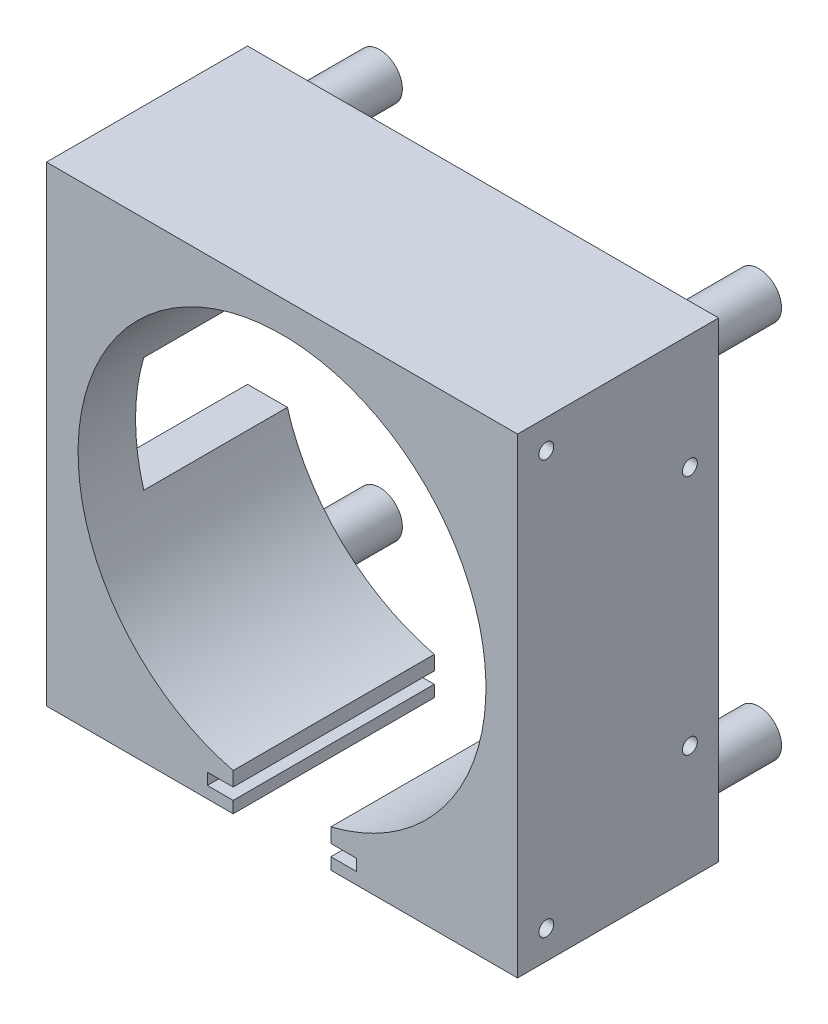
ISO-10303-21;
HEADER;
FILE_DESCRIPTION(('STEP AP214'),'2;1');
FILE_NAME('part.step','',(''),(''),'','','');
FILE_SCHEMA(('AUTOMOTIVE_DESIGN { 1 0 10303 214 1 1 1 1 }'));
ENDSEC;
DATA;
#1=APPLICATION_CONTEXT('core data for automotive mechanical design processes');
#2=APPLICATION_PROTOCOL_DEFINITION('international standard','automotive_design',2000,#1);
#3=PRODUCT_CONTEXT('',#1,'mechanical');
#4=PRODUCT('Part','Part','',(#3));
#5=PRODUCT_RELATED_PRODUCT_CATEGORY('part','',(#4));
#6=PRODUCT_DEFINITION_FORMATION('','',#4);
#7=PRODUCT_DEFINITION_CONTEXT('part definition',#1,'design');
#8=PRODUCT_DEFINITION('design','',#6,#7);
#9=PRODUCT_DEFINITION_SHAPE('','',#8);
#10=(LENGTH_UNIT() NAMED_UNIT(*) SI_UNIT(.MILLI.,.METRE.));
#11=(NAMED_UNIT(*) PLANE_ANGLE_UNIT() SI_UNIT($,.RADIAN.));
#12=(NAMED_UNIT(*) SI_UNIT($,.STERADIAN.) SOLID_ANGLE_UNIT());
#13=UNCERTAINTY_MEASURE_WITH_UNIT(LENGTH_MEASURE(1.E-05),#10,'distance_accuracy_value','');
#14=(GEOMETRIC_REPRESENTATION_CONTEXT(3) GLOBAL_UNCERTAINTY_ASSIGNED_CONTEXT((#13)) GLOBAL_UNIT_ASSIGNED_CONTEXT((#10,
#11,#12)) REPRESENTATION_CONTEXT('',''));
#15=CARTESIAN_POINT('',(0.,0.,0.));
#16=DIRECTION('',(0.,0.,1.));
#17=DIRECTION('',(1.,0.,0.));
#18=AXIS2_PLACEMENT_3D('',#15,#16,#17);
#19=CARTESIAN_POINT('',(0.,0.,0.));
#20=DIRECTION('',(0.,0.,-1.));
#21=DIRECTION('',(-1.,0.,0.));
#22=AXIS2_PLACEMENT_3D('',#19,#20,#21);
#23=PLANE('',#22);
#24=DIRECTION('',(0.,1.,0.));
#25=VECTOR('',#24,1.);
#26=CARTESIAN_POINT('',(-8.5,0.,0.));
#27=LINE('',#26,#25);
#28=CARTESIAN_POINT('',(-8.5,-41.,0.));
#29=VERTEX_POINT('',#28);
#30=CARTESIAN_POINT('',(-8.5,-38.9673758792282,0.));
#31=VERTEX_POINT('',#30);
#32=EDGE_CURVE('E236',#29,#31,#27,.T.);
#33=ORIENTED_EDGE('',*,*,#32,.F.);
#34=DIRECTION('',(1.,0.,0.));
#35=VECTOR('',#34,1.);
#36=CARTESIAN_POINT('',(-41.,-41.,0.));
#37=LINE('',#36,#35);
#38=CARTESIAN_POINT('',(-41.,-41.,0.));
#39=VERTEX_POINT('',#38);
#40=EDGE_CURVE('E362',#39,#29,#37,.T.);
#41=ORIENTED_EDGE('',*,*,#40,.F.);
#42=DIRECTION('',(0.,-1.,0.));
#43=VECTOR('',#42,1.);
#44=CARTESIAN_POINT('',(-41.,-41.,0.));
#45=LINE('',#44,#43);
#46=CARTESIAN_POINT('',(-41.,-10.,0.));
#47=VERTEX_POINT('',#46);
#48=EDGE_CURVE('E342',#47,#39,#45,.T.);
#49=ORIENTED_EDGE('',*,*,#48,.F.);
#50=DIRECTION('',(1.,0.,0.));
#51=VECTOR('',#50,1.);
#52=CARTESIAN_POINT('',(-41.,-10.,0.));
#53=LINE('',#52,#51);
#54=CARTESIAN_POINT('',(-34.0624426605022,-10.,0.));
#55=VERTEX_POINT('',#54);
#56=EDGE_CURVE('E335',#47,#55,#53,.T.);
#57=ORIENTED_EDGE('',*,*,#56,.T.);
#58=CARTESIAN_POINT('',(0.,0.,0.));
#59=DIRECTION('',(0.,0.,1.));
#60=DIRECTION('',(1.,0.,0.));
#61=AXIS2_PLACEMENT_3D('',#58,#59,#60);
#62=CIRCLE('',#61,35.5);
#63=CARTESIAN_POINT('',(-8.49999999999996,-34.4673758792282,0.));
#64=VERTEX_POINT('',#63);
#65=EDGE_CURVE('E343',#55,#64,#62,.T.);
#66=ORIENTED_EDGE('',*,*,#65,.T.);
#67=DIRECTION('',(0.,1.,0.));
#68=VECTOR('',#67,1.);
#69=CARTESIAN_POINT('',(-8.5,0.,0.));
#70=LINE('',#69,#68);
#71=CARTESIAN_POINT('',(-8.5,-36.9673758792282,0.));
#72=VERTEX_POINT('',#71);
#73=EDGE_CURVE('E57',#72,#64,#70,.T.);
#74=ORIENTED_EDGE('',*,*,#73,.F.);
#75=DIRECTION('',(1.,0.,0.));
#76=VECTOR('',#75,1.);
#77=CARTESIAN_POINT('',(0.,-36.9673758792282,0.));
#78=LINE('',#77,#76);
#79=CARTESIAN_POINT('',(-13.,-36.9673758792282,0.));
#80=VERTEX_POINT('',#79);
#81=EDGE_CURVE('E392',#80,#72,#78,.T.);
#82=ORIENTED_EDGE('',*,*,#81,.F.);
#83=DIRECTION('',(0.,1.,0.));
#84=VECTOR('',#83,1.);
#85=CARTESIAN_POINT('',(-13.,0.,0.));
#86=LINE('',#85,#84);
#87=CARTESIAN_POINT('',(-13.,-38.9673758792282,0.));
#88=VERTEX_POINT('',#87);
#89=EDGE_CURVE('E42',#88,#80,#86,.T.);
#90=ORIENTED_EDGE('',*,*,#89,.F.);
#91=DIRECTION('',(-1.,0.,0.));
#92=VECTOR('',#91,1.);
#93=CARTESIAN_POINT('',(0.,-38.9673758792282,0.));
#94=LINE('',#93,#92);
#95=EDGE_CURVE('E11',#31,#88,#94,.T.);
#96=ORIENTED_EDGE('',*,*,#95,.F.);
#97=EDGE_LOOP('',(#33,#41,#49,#57,#66,#74,#82,#90,#96));
#98=FACE_BOUND('',#97,.T.);
#99=CARTESIAN_POINT('',(-33.0000000000004,-32.9999999999997,0.));
#100=DIRECTION('',(0.,0.,-1.));
#101=DIRECTION('',(0.,-1.,0.));
#102=AXIS2_PLACEMENT_3D('',#99,#100,#101);
#103=CIRCLE('',#102,3.95);
#104=CARTESIAN_POINT('',(-33.0000000000004,-36.9499999999997,0.));
#105=VERTEX_POINT('',#104);
#106=EDGE_CURVE('E278',#105,#105,#103,.T.);
#107=ORIENTED_EDGE('',*,*,#106,.F.);
#108=EDGE_LOOP('',(#107));
#109=FACE_BOUND('',#108,.T.);
#110=ADVANCED_FACE('F34',(#98,#109),#23,.T.);
#111=CARTESIAN_POINT('',(-41.,-41.,35.));
#112=DIRECTION('',(0.,1.,0.));
#113=DIRECTION('',(0.,0.,1.));
#114=AXIS2_PLACEMENT_3D('',#111,#112,#113);
#115=PLANE('',#114);
#116=ORIENTED_EDGE('',*,*,#40,.T.);
#117=DIRECTION('',(0.,0.,1.));
#118=VECTOR('',#117,1.);
#119=CARTESIAN_POINT('',(-8.5,-41.,35.));
#120=LINE('',#119,#118);
#121=CARTESIAN_POINT('',(-8.5,-41.,35.));
#122=VERTEX_POINT('',#121);
#123=EDGE_CURVE('E384',#29,#122,#120,.T.);
#124=ORIENTED_EDGE('',*,*,#123,.T.);
#125=DIRECTION('',(1.,0.,0.));
#126=VECTOR('',#125,1.);
#127=CARTESIAN_POINT('',(-41.,-41.,35.));
#128=LINE('',#127,#126);
#129=CARTESIAN_POINT('',(-41.,-41.,35.));
#130=VERTEX_POINT('',#129);
#131=EDGE_CURVE('E351',#130,#122,#128,.T.);
#132=ORIENTED_EDGE('',*,*,#131,.F.);
#133=DIRECTION('',(0.,0.,-1.));
#134=VECTOR('',#133,1.);
#135=CARTESIAN_POINT('',(-41.,-41.,35.));
#136=LINE('',#135,#134);
#137=EDGE_CURVE('E376',#130,#39,#136,.T.);
#138=ORIENTED_EDGE('',*,*,#137,.T.);
#139=EDGE_LOOP('',(#116,#124,#132,#138));
#140=FACE_BOUND('',#139,.T.);
#141=ADVANCED_FACE('F422',(#140),#115,.F.);
#142=CARTESIAN_POINT('',(0.,0.,35.));
#143=DIRECTION('',(0.,0.,-1.));
#144=DIRECTION('',(-1.,0.,0.));
#145=AXIS2_PLACEMENT_3D('',#142,#143,#144);
#146=PLANE('',#145);
#147=ORIENTED_EDGE('',*,*,#131,.T.);
#148=DIRECTION('',(0.,-1.,0.));
#149=VECTOR('',#148,1.);
#150=CARTESIAN_POINT('',(-8.5,-41.4673758792282,35.));
#151=LINE('',#150,#149);
#152=CARTESIAN_POINT('',(-8.5,-38.9673758792282,35.));
#153=VERTEX_POINT('',#152);
#154=EDGE_CURVE('E192',#153,#122,#151,.T.);
#155=ORIENTED_EDGE('',*,*,#154,.F.);
#156=DIRECTION('',(1.,0.,0.));
#157=VECTOR('',#156,1.);
#158=CARTESIAN_POINT('',(-8.5,-38.9673758792282,35.));
#159=LINE('',#158,#157);
#160=CARTESIAN_POINT('',(-13.,-38.9673758792282,35.));
#161=VERTEX_POINT('',#160);
#162=EDGE_CURVE('E183',#161,#153,#159,.T.);
#163=ORIENTED_EDGE('',*,*,#162,.F.);
#164=DIRECTION('',(0.,-1.,0.));
#165=VECTOR('',#164,1.);
#166=CARTESIAN_POINT('',(-13.,-38.9673758792282,35.));
#167=LINE('',#166,#165);
#168=CARTESIAN_POINT('',(-13.,-36.9673758792282,35.));
#169=VERTEX_POINT('',#168);
#170=EDGE_CURVE('E213',#169,#161,#167,.T.);
#171=ORIENTED_EDGE('',*,*,#170,.F.);
#172=DIRECTION('',(-1.,0.,0.));
#173=VECTOR('',#172,1.);
#174=CARTESIAN_POINT('',(-8.5,-36.9673758792282,35.));
#175=LINE('',#174,#173);
#176=CARTESIAN_POINT('',(-8.5,-36.9673758792282,35.));
#177=VERTEX_POINT('',#176);
#178=EDGE_CURVE('E210',#177,#169,#175,.T.);
#179=ORIENTED_EDGE('',*,*,#178,.F.);
#180=DIRECTION('',(0.,-1.,0.));
#181=VECTOR('',#180,1.);
#182=CARTESIAN_POINT('',(-8.5,-36.9673758792282,35.));
#183=LINE('',#182,#181);
#184=CARTESIAN_POINT('',(-8.5,-34.4673758792282,35.));
#185=VERTEX_POINT('',#184);
#186=EDGE_CURVE('E207',#185,#177,#183,.T.);
#187=ORIENTED_EDGE('',*,*,#186,.F.);
#188=CARTESIAN_POINT('',(0.,0.,35.));
#189=DIRECTION('',(0.,0.,1.));
#190=DIRECTION('',(1.,0.,0.));
#191=AXIS2_PLACEMENT_3D('',#188,#189,#190);
#192=CIRCLE('',#191,35.5);
#193=CARTESIAN_POINT('',(8.49999999999996,-34.4673758792282,35.));
#194=VERTEX_POINT('',#193);
#195=EDGE_CURVE('E339',#194,#185,#192,.T.);
#196=ORIENTED_EDGE('',*,*,#195,.F.);
#197=DIRECTION('',(0.,1.,0.));
#198=VECTOR('',#197,1.);
#199=CARTESIAN_POINT('',(8.5,-36.9673758792282,35.));
#200=LINE('',#199,#198);
#201=CARTESIAN_POINT('',(8.5,-36.9673758792282,35.));
#202=VERTEX_POINT('',#201);
#203=EDGE_CURVE('E49',#202,#194,#200,.T.);
#204=ORIENTED_EDGE('',*,*,#203,.F.);
#205=DIRECTION('',(-1.,0.,0.));
#206=VECTOR('',#205,1.);
#207=CARTESIAN_POINT('',(8.5,-36.9673758792282,35.));
#208=LINE('',#207,#206);
#209=CARTESIAN_POINT('',(13.,-36.9673758792282,35.));
#210=VERTEX_POINT('',#209);
#211=EDGE_CURVE('E200',#210,#202,#208,.T.);
#212=ORIENTED_EDGE('',*,*,#211,.F.);
#213=DIRECTION('',(0.,1.,0.));
#214=VECTOR('',#213,1.);
#215=CARTESIAN_POINT('',(13.,-38.9673758792282,35.));
#216=LINE('',#215,#214);
#217=CARTESIAN_POINT('',(13.,-38.9673758792282,35.));
#218=VERTEX_POINT('',#217);
#219=EDGE_CURVE('E198',#218,#210,#216,.T.);
#220=ORIENTED_EDGE('',*,*,#219,.F.);
#221=DIRECTION('',(1.,0.,0.));
#222=VECTOR('',#221,1.);
#223=CARTESIAN_POINT('',(8.5,-38.9673758792282,35.));
#224=LINE('',#223,#222);
#225=CARTESIAN_POINT('',(8.5,-38.9673758792282,35.));
#226=VERTEX_POINT('',#225);
#227=EDGE_CURVE('E176',#226,#218,#224,.T.);
#228=ORIENTED_EDGE('',*,*,#227,.F.);
#229=DIRECTION('',(0.,1.,0.));
#230=VECTOR('',#229,1.);
#231=CARTESIAN_POINT('',(8.5,-41.4673758792282,35.));
#232=LINE('',#231,#230);
#233=CARTESIAN_POINT('',(8.5,-41.,35.));
#234=VERTEX_POINT('',#233);
#235=EDGE_CURVE('E186',#234,#226,#232,.T.);
#236=ORIENTED_EDGE('',*,*,#235,.F.);
#237=CARTESIAN_POINT('',(41.,-41.,35.));
#238=VERTEX_POINT('',#237);
#239=EDGE_CURVE('E349',#234,#238,#128,.T.);
#240=ORIENTED_EDGE('',*,*,#239,.T.);
#241=DIRECTION('',(0.,1.,0.));
#242=VECTOR('',#241,1.);
#243=CARTESIAN_POINT('',(41.,-41.,35.));
#244=LINE('',#243,#242);
#245=CARTESIAN_POINT('',(41.,41.,35.));
#246=VERTEX_POINT('',#245);
#247=EDGE_CURVE('E353',#238,#246,#244,.T.);
#248=ORIENTED_EDGE('',*,*,#247,.T.);
#249=DIRECTION('',(-1.,0.,0.));
#250=VECTOR('',#249,1.);
#251=CARTESIAN_POINT('',(-41.,41.,35.));
#252=LINE('',#251,#250);
#253=CARTESIAN_POINT('',(-41.,41.,35.));
#254=VERTEX_POINT('',#253);
#255=EDGE_CURVE('E355',#246,#254,#252,.T.);
#256=ORIENTED_EDGE('',*,*,#255,.T.);
#257=DIRECTION('',(0.,-1.,0.));
#258=VECTOR('',#257,1.);
#259=CARTESIAN_POINT('',(-41.,-41.,35.));
#260=LINE('',#259,#258);
#261=EDGE_CURVE('E346',#254,#130,#260,.T.);
#262=ORIENTED_EDGE('',*,*,#261,.T.);
#263=EDGE_LOOP('',(#147,#155,#163,#171,#179,#187,#196,#204,#212,#220,#228,#236,#240,#248,#256,#262));
#264=FACE_BOUND('',#263,.T.);
#265=ADVANCED_FACE('F195',(#264),#146,.F.);
#266=DIRECTION('',(0.,-1.,0.));
#267=VECTOR('',#266,1.);
#268=CARTESIAN_POINT('',(8.5,0.,0.));
#269=LINE('',#268,#267);
#270=CARTESIAN_POINT('',(8.5,-34.4673758792282,0.));
#271=VERTEX_POINT('',#270);
#272=CARTESIAN_POINT('',(8.5,-36.9673758792282,0.));
#273=VERTEX_POINT('',#272);
#274=EDGE_CURVE('E220',#271,#273,#269,.T.);
#275=ORIENTED_EDGE('',*,*,#274,.F.);
#276=CARTESIAN_POINT('',(-34.0624426605022,10.,0.));
#277=VERTEX_POINT('',#276);
#278=EDGE_CURVE('E338',#271,#277,#62,.T.);
#279=ORIENTED_EDGE('',*,*,#278,.T.);
#280=DIRECTION('',(-1.,0.,0.));
#281=VECTOR('',#280,1.);
#282=CARTESIAN_POINT('',(-41.,10.,0.));
#283=LINE('',#282,#281);
#284=CARTESIAN_POINT('',(-41.,10.,0.));
#285=VERTEX_POINT('',#284);
#286=EDGE_CURVE('E316',#277,#285,#283,.T.);
#287=ORIENTED_EDGE('',*,*,#286,.T.);
#288=CARTESIAN_POINT('',(-41.,41.,0.));
#289=VERTEX_POINT('',#288);
#290=EDGE_CURVE('E358',#289,#285,#45,.T.);
#291=ORIENTED_EDGE('',*,*,#290,.F.);
#292=DIRECTION('',(-1.,0.,0.));
#293=VECTOR('',#292,1.);
#294=CARTESIAN_POINT('',(-41.,41.,0.));
#295=LINE('',#294,#293);
#296=CARTESIAN_POINT('',(41.,41.,0.));
#297=VERTEX_POINT('',#296);
#298=EDGE_CURVE('E350',#297,#289,#295,.T.);
#299=ORIENTED_EDGE('',*,*,#298,.F.);
#300=DIRECTION('',(0.,1.,0.));
#301=VECTOR('',#300,1.);
#302=CARTESIAN_POINT('',(41.,-41.,0.));
#303=LINE('',#302,#301);
#304=CARTESIAN_POINT('',(41.,-41.,0.));
#305=VERTEX_POINT('',#304);
#306=EDGE_CURVE('E365',#305,#297,#303,.T.);
#307=ORIENTED_EDGE('',*,*,#306,.F.);
#308=CARTESIAN_POINT('',(8.5,-41.,0.));
#309=VERTEX_POINT('',#308);
#310=EDGE_CURVE('E361',#309,#305,#37,.T.);
#311=ORIENTED_EDGE('',*,*,#310,.F.);
#312=DIRECTION('',(0.,-1.,0.));
#313=VECTOR('',#312,1.);
#314=CARTESIAN_POINT('',(8.5,0.,0.));
#315=LINE('',#314,#313);
#316=CARTESIAN_POINT('',(8.5,-38.9673758792282,0.));
#317=VERTEX_POINT('',#316);
#318=EDGE_CURVE('E234',#317,#309,#315,.T.);
#319=ORIENTED_EDGE('',*,*,#318,.F.);
#320=DIRECTION('',(-1.,0.,0.));
#321=VECTOR('',#320,1.);
#322=CARTESIAN_POINT('',(0.,-38.9673758792282,0.));
#323=LINE('',#322,#321);
#324=CARTESIAN_POINT('',(13.,-38.9673758792282,0.));
#325=VERTEX_POINT('',#324);
#326=EDGE_CURVE('E179',#325,#317,#323,.T.);
#327=ORIENTED_EDGE('',*,*,#326,.F.);
#328=DIRECTION('',(0.,-1.,0.));
#329=VECTOR('',#328,1.);
#330=CARTESIAN_POINT('',(13.,0.,0.));
#331=LINE('',#330,#329);
#332=CARTESIAN_POINT('',(13.,-36.9673758792282,0.));
#333=VERTEX_POINT('',#332);
#334=EDGE_CURVE('E388',#333,#325,#331,.T.);
#335=ORIENTED_EDGE('',*,*,#334,.F.);
#336=DIRECTION('',(1.,0.,0.));
#337=VECTOR('',#336,1.);
#338=CARTESIAN_POINT('',(0.,-36.9673758792282,0.));
#339=LINE('',#338,#337);
#340=EDGE_CURVE('E390',#273,#333,#339,.T.);
#341=ORIENTED_EDGE('',*,*,#340,.F.);
#342=EDGE_LOOP('',(#275,#279,#287,#291,#299,#307,#311,#319,#327,#335,#341));
#343=FACE_BOUND('',#342,.T.);
#344=CARTESIAN_POINT('',(33.,-33.,0.));
#345=DIRECTION('',(0.,0.,-1.));
#346=DIRECTION('',(1.,0.,0.));
#347=AXIS2_PLACEMENT_3D('',#344,#345,#346);
#348=CIRCLE('',#347,3.95);
#349=CARTESIAN_POINT('',(36.95,-33.,0.));
#350=VERTEX_POINT('',#349);
#351=EDGE_CURVE('E290',#350,#350,#348,.T.);
#352=ORIENTED_EDGE('',*,*,#351,.F.);
#353=EDGE_LOOP('',(#352));
#354=FACE_BOUND('',#353,.T.);
#355=CARTESIAN_POINT('',(33.0000000000001,32.9999999999999,0.));
#356=DIRECTION('',(0.,0.,-1.));
#357=DIRECTION('',(0.,1.,0.));
#358=AXIS2_PLACEMENT_3D('',#355,#356,#357);
#359=CIRCLE('',#358,3.95);
#360=CARTESIAN_POINT('',(33.0000000000001,36.9499999999999,0.));
#361=VERTEX_POINT('',#360);
#362=EDGE_CURVE('E296',#361,#361,#359,.T.);
#363=ORIENTED_EDGE('',*,*,#362,.F.);
#364=EDGE_LOOP('',(#363));
#365=FACE_BOUND('',#364,.T.);
#366=CARTESIAN_POINT('',(-33.,33.,0.));
#367=DIRECTION('',(0.,0.,-1.));
#368=DIRECTION('',(-1.,0.,0.));
#369=AXIS2_PLACEMENT_3D('',#366,#367,#368);
#370=CIRCLE('',#369,3.95);
#371=CARTESIAN_POINT('',(-36.95,33.,0.));
#372=VERTEX_POINT('',#371);
#373=EDGE_CURVE('E302',#372,#372,#370,.T.);
#374=ORIENTED_EDGE('',*,*,#373,.F.);
#375=EDGE_LOOP('',(#374));
#376=FACE_BOUND('',#375,.T.);
#377=ADVANCED_FACE('F441',(#343,#354,#365,#376),#23,.T.);
#378=CARTESIAN_POINT('',(-41.,-41.,35.));
#379=DIRECTION('',(1.,0.,0.));
#380=DIRECTION('',(0.,0.,-1.));
#381=AXIS2_PLACEMENT_3D('',#378,#379,#380);
#382=PLANE('',#381);
#383=CARTESIAN_POINT('',(-41.,21.,5.));
#384=DIRECTION('',(1.,0.,0.));
#385=DIRECTION('',(0.,0.,1.));
#386=AXIS2_PLACEMENT_3D('',#383,#384,#385);
#387=CIRCLE('',#386,1.3);
#388=CARTESIAN_POINT('',(-41.,21.,6.3));
#389=VERTEX_POINT('',#388);
#390=EDGE_CURVE('E267',#389,#389,#387,.T.);
#391=ORIENTED_EDGE('',*,*,#390,.T.);
#392=EDGE_LOOP('',(#391));
#393=FACE_BOUND('',#392,.T.);
#394=CARTESIAN_POINT('',(-41.,36.,30.));
#395=DIRECTION('',(1.,0.,0.));
#396=DIRECTION('',(0.,0.,1.));
#397=AXIS2_PLACEMENT_3D('',#394,#395,#396);
#398=CIRCLE('',#397,1.3);
#399=CARTESIAN_POINT('',(-41.,36.,31.3));
#400=VERTEX_POINT('',#399);
#401=EDGE_CURVE('E254',#400,#400,#398,.T.);
#402=ORIENTED_EDGE('',*,*,#401,.T.);
#403=EDGE_LOOP('',(#402));
#404=FACE_BOUND('',#403,.T.);
#405=CARTESIAN_POINT('',(-41.,-21.,5.));
#406=DIRECTION('',(-1.,0.,0.));
#407=DIRECTION('',(0.,0.,1.));
#408=AXIS2_PLACEMENT_3D('',#405,#406,#407);
#409=CIRCLE('',#408,1.3);
#410=CARTESIAN_POINT('',(-41.,-21.,6.3));
#411=VERTEX_POINT('',#410);
#412=EDGE_CURVE('E279',#411,#411,#409,.T.);
#413=ORIENTED_EDGE('',*,*,#412,.F.);
#414=EDGE_LOOP('',(#413));
#415=FACE_BOUND('',#414,.T.);
#416=CARTESIAN_POINT('',(-41.,-36.,30.));
#417=DIRECTION('',(-1.,0.,0.));
#418=DIRECTION('',(0.,0.,1.));
#419=AXIS2_PLACEMENT_3D('',#416,#417,#418);
#420=CIRCLE('',#419,1.3);
#421=CARTESIAN_POINT('',(-41.,-36.,31.3));
#422=VERTEX_POINT('',#421);
#423=EDGE_CURVE('E266',#422,#422,#420,.T.);
#424=ORIENTED_EDGE('',*,*,#423,.F.);
#425=EDGE_LOOP('',(#424));
#426=FACE_BOUND('',#425,.T.);
#427=ORIENTED_EDGE('',*,*,#290,.T.);
#428=DIRECTION('',(0.,0.,1.));
#429=VECTOR('',#428,1.);
#430=CARTESIAN_POINT('',(-41.,10.,-0.001000000000001));
#431=LINE('',#430,#429);
#432=CARTESIAN_POINT('',(-41.,10.,25.));
#433=VERTEX_POINT('',#432);
#434=EDGE_CURVE('E328',#285,#433,#431,.T.);
#435=ORIENTED_EDGE('',*,*,#434,.T.);
#436=DIRECTION('',(0.,-1.,0.));
#437=VECTOR('',#436,1.);
#438=CARTESIAN_POINT('',(-41.,10.,25.));
#439=LINE('',#438,#437);
#440=CARTESIAN_POINT('',(-41.,-10.,25.));
#441=VERTEX_POINT('',#440);
#442=EDGE_CURVE('E319',#433,#441,#439,.T.);
#443=ORIENTED_EDGE('',*,*,#442,.T.);
#444=DIRECTION('',(0.,0.,1.));
#445=VECTOR('',#444,1.);
#446=CARTESIAN_POINT('',(-41.,-10.,-0.001000000000001));
#447=LINE('',#446,#445);
#448=EDGE_CURVE('E327',#47,#441,#447,.T.);
#449=ORIENTED_EDGE('',*,*,#448,.F.);
#450=ORIENTED_EDGE('',*,*,#48,.T.);
#451=ORIENTED_EDGE('',*,*,#137,.F.);
#452=ORIENTED_EDGE('',*,*,#261,.F.);
#453=DIRECTION('',(0.,0.,-1.));
#454=VECTOR('',#453,1.);
#455=CARTESIAN_POINT('',(-41.,41.,35.));
#456=LINE('',#455,#454);
#457=EDGE_CURVE('E357',#254,#289,#456,.T.);
#458=ORIENTED_EDGE('',*,*,#457,.T.);
#459=EDGE_LOOP('',(#427,#435,#443,#449,#450,#451,#452,#458));
#460=FACE_BOUND('',#459,.T.);
#461=ADVANCED_FACE('F36',(#393,#404,#415,#426,#460),#382,.F.);
#462=ORIENTED_EDGE('',*,*,#239,.F.);
#463=DIRECTION('',(0.,0.,-1.));
#464=VECTOR('',#463,1.);
#465=CARTESIAN_POINT('',(8.5,-41.,35.));
#466=LINE('',#465,#464);
#467=EDGE_CURVE('E189',#234,#309,#466,.T.);
#468=ORIENTED_EDGE('',*,*,#467,.T.);
#469=ORIENTED_EDGE('',*,*,#310,.T.);
#470=DIRECTION('',(0.,0.,-1.));
#471=VECTOR('',#470,1.);
#472=CARTESIAN_POINT('',(41.,-41.,35.));
#473=LINE('',#472,#471);
#474=EDGE_CURVE('E373',#238,#305,#473,.T.);
#475=ORIENTED_EDGE('',*,*,#474,.F.);
#476=EDGE_LOOP('',(#462,#468,#469,#475));
#477=FACE_BOUND('',#476,.T.);
#478=ADVANCED_FACE('F456',(#477),#115,.F.);
#479=CARTESIAN_POINT('',(41.,-41.,35.));
#480=DIRECTION('',(-1.,0.,0.));
#481=DIRECTION('',(0.,-1.,0.));
#482=AXIS2_PLACEMENT_3D('',#479,#480,#481);
#483=PLANE('',#482);
#484=CARTESIAN_POINT('',(41.,-21.,5.));
#485=DIRECTION('',(-1.,0.,0.));
#486=DIRECTION('',(0.,0.,1.));
#487=AXIS2_PLACEMENT_3D('',#484,#485,#486);
#488=CIRCLE('',#487,1.3);
#489=CARTESIAN_POINT('',(41.,-21.,6.3));
#490=VERTEX_POINT('',#489);
#491=EDGE_CURVE('E243',#490,#490,#488,.T.);
#492=ORIENTED_EDGE('',*,*,#491,.T.);
#493=EDGE_LOOP('',(#492));
#494=FACE_BOUND('',#493,.T.);
#495=CARTESIAN_POINT('',(41.,-36.,30.));
#496=DIRECTION('',(-1.,0.,0.));
#497=DIRECTION('',(0.,0.,1.));
#498=AXIS2_PLACEMENT_3D('',#495,#496,#497);
#499=CIRCLE('',#498,1.3);
#500=CARTESIAN_POINT('',(41.,-36.,31.3));
#501=VERTEX_POINT('',#500);
#502=EDGE_CURVE('E238',#501,#501,#499,.T.);
#503=ORIENTED_EDGE('',*,*,#502,.T.);
#504=EDGE_LOOP('',(#503));
#505=FACE_BOUND('',#504,.T.);
#506=CARTESIAN_POINT('',(41.,21.,5.));
#507=DIRECTION('',(1.,0.,0.));
#508=DIRECTION('',(0.,0.,1.));
#509=AXIS2_PLACEMENT_3D('',#506,#507,#508);
#510=CIRCLE('',#509,1.3);
#511=CARTESIAN_POINT('',(41.,21.,6.3));
#512=VERTEX_POINT('',#511);
#513=EDGE_CURVE('E255',#512,#512,#510,.T.);
#514=ORIENTED_EDGE('',*,*,#513,.F.);
#515=EDGE_LOOP('',(#514));
#516=FACE_BOUND('',#515,.T.);
#517=CARTESIAN_POINT('',(41.,36.,30.));
#518=DIRECTION('',(1.,0.,0.));
#519=DIRECTION('',(0.,0.,1.));
#520=AXIS2_PLACEMENT_3D('',#517,#518,#519);
#521=CIRCLE('',#520,1.3);
#522=CARTESIAN_POINT('',(41.,36.,31.3));
#523=VERTEX_POINT('',#522);
#524=EDGE_CURVE('E242',#523,#523,#521,.T.);
#525=ORIENTED_EDGE('',*,*,#524,.F.);
#526=EDGE_LOOP('',(#525));
#527=FACE_BOUND('',#526,.T.);
#528=ORIENTED_EDGE('',*,*,#306,.T.);
#529=DIRECTION('',(0.,0.,-1.));
#530=VECTOR('',#529,1.);
#531=CARTESIAN_POINT('',(41.,41.,35.));
#532=LINE('',#531,#530);
#533=EDGE_CURVE('E370',#246,#297,#532,.T.);
#534=ORIENTED_EDGE('',*,*,#533,.F.);
#535=ORIENTED_EDGE('',*,*,#247,.F.);
#536=ORIENTED_EDGE('',*,*,#474,.T.);
#537=EDGE_LOOP('',(#528,#534,#535,#536));
#538=FACE_BOUND('',#537,.T.);
#539=ADVANCED_FACE('F452',(#494,#505,#516,#527,#538),#483,.F.);
#540=CARTESIAN_POINT('',(-41.,41.,35.));
#541=DIRECTION('',(0.,-1.,0.));
#542=DIRECTION('',(1.,0.,0.));
#543=AXIS2_PLACEMENT_3D('',#540,#541,#542);
#544=PLANE('',#543);
#545=ORIENTED_EDGE('',*,*,#298,.T.);
#546=ORIENTED_EDGE('',*,*,#457,.F.);
#547=ORIENTED_EDGE('',*,*,#255,.F.);
#548=ORIENTED_EDGE('',*,*,#533,.T.);
#549=EDGE_LOOP('',(#545,#546,#547,#548));
#550=FACE_BOUND('',#549,.T.);
#551=ADVANCED_FACE('F447',(#550),#544,.F.);
#552=CARTESIAN_POINT('',(0.,0.,35.));
#553=DIRECTION('',(0.,0.,-1.));
#554=DIRECTION('',(-1.,0.,0.));
#555=AXIS2_PLACEMENT_3D('',#552,#553,#554);
#556=CYLINDRICAL_SURFACE('',#555,35.5);
#557=DIRECTION('',(0.,0.,-1.));
#558=VECTOR('',#557,1.);
#559=CARTESIAN_POINT('',(-8.49999999999996,-34.4673758792282,35.));
#560=LINE('',#559,#558);
#561=EDGE_CURVE('E381',#64,#185,#560,.F.);
#562=ORIENTED_EDGE('',*,*,#561,.F.);
#563=ORIENTED_EDGE('',*,*,#65,.F.);
#564=DIRECTION('',(0.,0.,-1.));
#565=VECTOR('',#564,1.);
#566=CARTESIAN_POINT('',(-34.0624426605022,-10.,35.));
#567=LINE('',#566,#565);
#568=CARTESIAN_POINT('',(-34.0624426605022,-10.,25.));
#569=VERTEX_POINT('',#568);
#570=EDGE_CURVE('E308',#55,#569,#567,.F.);
#571=ORIENTED_EDGE('',*,*,#570,.T.);
#572=CARTESIAN_POINT('',(0.,0.,25.));
#573=DIRECTION('',(0.,0.,1.));
#574=DIRECTION('',(1.,0.,0.));
#575=AXIS2_PLACEMENT_3D('',#572,#573,#574);
#576=CIRCLE('',#575,35.5);
#577=CARTESIAN_POINT('',(-34.0624426605022,10.,25.));
#578=VERTEX_POINT('',#577);
#579=EDGE_CURVE('E331',#569,#578,#576,.F.);
#580=ORIENTED_EDGE('',*,*,#579,.T.);
#581=DIRECTION('',(0.,0.,-1.));
#582=VECTOR('',#581,1.);
#583=CARTESIAN_POINT('',(-34.0624426605022,10.,35.));
#584=LINE('',#583,#582);
#585=EDGE_CURVE('E313',#578,#277,#584,.T.);
#586=ORIENTED_EDGE('',*,*,#585,.T.);
#587=ORIENTED_EDGE('',*,*,#278,.F.);
#588=DIRECTION('',(0.,0.,-1.));
#589=VECTOR('',#588,1.);
#590=CARTESIAN_POINT('',(8.5,-34.4673758792282,35.));
#591=LINE('',#590,#589);
#592=EDGE_CURVE('E379',#194,#271,#591,.T.);
#593=ORIENTED_EDGE('',*,*,#592,.F.);
#594=ORIENTED_EDGE('',*,*,#195,.T.);
#595=EDGE_LOOP('',(#562,#563,#571,#580,#586,#587,#593,#594));
#596=FACE_BOUND('',#595,.T.);
#597=ADVANCED_FACE('F410',(#596),#556,.F.);
#598=CARTESIAN_POINT('',(-41.,10.,-0.001000000000001));
#599=DIRECTION('',(0.,1.,0.));
#600=DIRECTION('',(-1.,0.,0.));
#601=AXIS2_PLACEMENT_3D('',#598,#599,#600);
#602=PLANE('',#601);
#603=ORIENTED_EDGE('',*,*,#585,.F.);
#604=DIRECTION('',(-1.,0.,0.));
#605=VECTOR('',#604,1.);
#606=CARTESIAN_POINT('',(-41.,10.,25.));
#607=LINE('',#606,#605);
#608=EDGE_CURVE('E325',#578,#433,#607,.T.);
#609=ORIENTED_EDGE('',*,*,#608,.T.);
#610=ORIENTED_EDGE('',*,*,#434,.F.);
#611=ORIENTED_EDGE('',*,*,#286,.F.);
#612=EDGE_LOOP('',(#603,#609,#610,#611));
#613=FACE_BOUND('',#612,.T.);
#614=ADVANCED_FACE('F437',(#613),#602,.F.);
#615=CARTESIAN_POINT('',(-41.,-10.,-0.001000000000001));
#616=DIRECTION('',(0.,-1.,0.));
#617=DIRECTION('',(1.,0.,0.));
#618=AXIS2_PLACEMENT_3D('',#615,#616,#617);
#619=PLANE('',#618);
#620=ORIENTED_EDGE('',*,*,#448,.T.);
#621=DIRECTION('',(1.,0.,0.));
#622=VECTOR('',#621,1.);
#623=CARTESIAN_POINT('',(-41.,-10.,25.));
#624=LINE('',#623,#622);
#625=EDGE_CURVE('E322',#441,#569,#624,.T.);
#626=ORIENTED_EDGE('',*,*,#625,.T.);
#627=ORIENTED_EDGE('',*,*,#570,.F.);
#628=ORIENTED_EDGE('',*,*,#56,.F.);
#629=EDGE_LOOP('',(#620,#626,#627,#628));
#630=FACE_BOUND('',#629,.T.);
#631=ADVANCED_FACE('F430',(#630),#619,.F.);
#632=CARTESIAN_POINT('',(0.,0.,25.));
#633=DIRECTION('',(0.,0.,1.));
#634=DIRECTION('',(1.,0.,0.));
#635=AXIS2_PLACEMENT_3D('',#632,#633,#634);
#636=PLANE('',#635);
#637=ORIENTED_EDGE('',*,*,#625,.F.);
#638=ORIENTED_EDGE('',*,*,#442,.F.);
#639=ORIENTED_EDGE('',*,*,#608,.F.);
#640=ORIENTED_EDGE('',*,*,#579,.F.);
#641=EDGE_LOOP('',(#637,#638,#639,#640));
#642=FACE_BOUND('',#641,.T.);
#643=ADVANCED_FACE('F432',(#642),#636,.F.);
#644=CARTESIAN_POINT('',(-33.,33.,-15.));
#645=DIRECTION('',(0.,0.,1.));
#646=DIRECTION('',(1.,0.,0.));
#647=AXIS2_PLACEMENT_3D('',#644,#645,#646);
#648=CYLINDRICAL_SURFACE('',#647,3.95);
#649=CARTESIAN_POINT('',(-33.,33.,-15.));
#650=DIRECTION('',(0.,0.,-1.));
#651=DIRECTION('',(-1.,0.,0.));
#652=AXIS2_PLACEMENT_3D('',#649,#650,#651);
#653=CIRCLE('',#652,3.95);
#654=CARTESIAN_POINT('',(-36.95,33.,-15.));
#655=VERTEX_POINT('',#654);
#656=EDGE_CURVE('E305',#655,#655,#653,.T.);
#657=ORIENTED_EDGE('',*,*,#656,.F.);
#658=EDGE_LOOP('',(#657));
#659=FACE_BOUND('',#658,.T.);
#660=ORIENTED_EDGE('',*,*,#373,.T.);
#661=EDGE_LOOP('',(#660));
#662=FACE_BOUND('',#661,.T.);
#663=ADVANCED_FACE('F487',(#659,#662),#648,.T.);
#664=CARTESIAN_POINT('',(-33.,33.,-15.));
#665=DIRECTION('',(0.,0.,-1.));
#666=DIRECTION('',(-1.,0.,0.));
#667=AXIS2_PLACEMENT_3D('',#664,#665,#666);
#668=PLANE('',#667);
#669=ORIENTED_EDGE('',*,*,#656,.T.);
#670=EDGE_LOOP('',(#669));
#671=FACE_BOUND('',#670,.T.);
#672=ADVANCED_FACE('F490',(#671),#668,.T.);
#673=CARTESIAN_POINT('',(33.0000000000001,32.9999999999999,-15.));
#674=DIRECTION('',(0.,0.,1.));
#675=DIRECTION('',(1.,0.,0.));
#676=AXIS2_PLACEMENT_3D('',#673,#674,#675);
#677=CYLINDRICAL_SURFACE('',#676,3.95);
#678=CARTESIAN_POINT('',(33.0000000000001,32.9999999999999,-15.));
#679=DIRECTION('',(0.,0.,-1.));
#680=DIRECTION('',(0.,1.,0.));
#681=AXIS2_PLACEMENT_3D('',#678,#679,#680);
#682=CIRCLE('',#681,3.95);
#683=CARTESIAN_POINT('',(33.0000000000001,36.9499999999999,-15.));
#684=VERTEX_POINT('',#683);
#685=EDGE_CURVE('E299',#684,#684,#682,.T.);
#686=ORIENTED_EDGE('',*,*,#685,.F.);
#687=EDGE_LOOP('',(#686));
#688=FACE_BOUND('',#687,.T.);
#689=ORIENTED_EDGE('',*,*,#362,.T.);
#690=EDGE_LOOP('',(#689));
#691=FACE_BOUND('',#690,.T.);
#692=ADVANCED_FACE('F494',(#688,#691),#677,.T.);
#693=CARTESIAN_POINT('',(33.0000000000001,32.9999999999999,-15.));
#694=DIRECTION('',(0.,0.,-1.));
#695=DIRECTION('',(0.,1.,0.));
#696=AXIS2_PLACEMENT_3D('',#693,#694,#695);
#697=PLANE('',#696);
#698=ORIENTED_EDGE('',*,*,#685,.T.);
#699=EDGE_LOOP('',(#698));
#700=FACE_BOUND('',#699,.T.);
#701=ADVANCED_FACE('F498',(#700),#697,.T.);
#702=CARTESIAN_POINT('',(33.,-33.,-15.));
#703=DIRECTION('',(0.,0.,1.));
#704=DIRECTION('',(1.,0.,0.));
#705=AXIS2_PLACEMENT_3D('',#702,#703,#704);
#706=CYLINDRICAL_SURFACE('',#705,3.95);
#707=CARTESIAN_POINT('',(33.,-33.,-15.));
#708=DIRECTION('',(0.,0.,-1.));
#709=DIRECTION('',(1.,0.,0.));
#710=AXIS2_PLACEMENT_3D('',#707,#708,#709);
#711=CIRCLE('',#710,3.95);
#712=CARTESIAN_POINT('',(36.95,-33.,-15.));
#713=VERTEX_POINT('',#712);
#714=EDGE_CURVE('E293',#713,#713,#711,.T.);
#715=ORIENTED_EDGE('',*,*,#714,.F.);
#716=EDGE_LOOP('',(#715));
#717=FACE_BOUND('',#716,.T.);
#718=ORIENTED_EDGE('',*,*,#351,.T.);
#719=EDGE_LOOP('',(#718));
#720=FACE_BOUND('',#719,.T.);
#721=ADVANCED_FACE('F502',(#717,#720),#706,.T.);
#722=CARTESIAN_POINT('',(33.,-33.,-15.));
#723=DIRECTION('',(0.,0.,-1.));
#724=DIRECTION('',(1.,0.,0.));
#725=AXIS2_PLACEMENT_3D('',#722,#723,#724);
#726=PLANE('',#725);
#727=ORIENTED_EDGE('',*,*,#714,.T.);
#728=EDGE_LOOP('',(#727));
#729=FACE_BOUND('',#728,.T.);
#730=ADVANCED_FACE('F506',(#729),#726,.T.);
#731=CARTESIAN_POINT('',(-33.0000000000004,-32.9999999999997,-15.));
#732=DIRECTION('',(0.,0.,1.));
#733=DIRECTION('',(1.,0.,0.));
#734=AXIS2_PLACEMENT_3D('',#731,#732,#733);
#735=CYLINDRICAL_SURFACE('',#734,3.95);
#736=CARTESIAN_POINT('',(-33.0000000000004,-32.9999999999997,-15.));
#737=DIRECTION('',(0.,0.,-1.));
#738=DIRECTION('',(0.,-1.,0.));
#739=AXIS2_PLACEMENT_3D('',#736,#737,#738);
#740=CIRCLE('',#739,3.95);
#741=CARTESIAN_POINT('',(-33.0000000000004,-36.9499999999997,-15.));
#742=VERTEX_POINT('',#741);
#743=EDGE_CURVE('E287',#742,#742,#740,.T.);
#744=ORIENTED_EDGE('',*,*,#743,.F.);
#745=EDGE_LOOP('',(#744));
#746=FACE_BOUND('',#745,.T.);
#747=ORIENTED_EDGE('',*,*,#106,.T.);
#748=EDGE_LOOP('',(#747));
#749=FACE_BOUND('',#748,.T.);
#750=ADVANCED_FACE('F510',(#746,#749),#735,.T.);
#751=CARTESIAN_POINT('',(-33.0000000000004,-32.9999999999997,-15.));
#752=DIRECTION('',(0.,0.,-1.));
#753=DIRECTION('',(0.,-1.,0.));
#754=AXIS2_PLACEMENT_3D('',#751,#752,#753);
#755=PLANE('',#754);
#756=ORIENTED_EDGE('',*,*,#743,.T.);
#757=EDGE_LOOP('',(#756));
#758=FACE_BOUND('',#757,.T.);
#759=ADVANCED_FACE('F514',(#758),#755,.T.);
#760=CARTESIAN_POINT('',(-32.,-36.,30.));
#761=DIRECTION('',(-1.,0.,0.));
#762=DIRECTION('',(0.,0.,1.));
#763=AXIS2_PLACEMENT_3D('',#760,#761,#762);
#764=CYLINDRICAL_SURFACE('',#763,1.3);
#765=CARTESIAN_POINT('',(-32.,-36.,30.));
#766=DIRECTION('',(-1.,0.,0.));
#767=DIRECTION('',(0.,0.,1.));
#768=AXIS2_PLACEMENT_3D('',#765,#766,#767);
#769=CIRCLE('',#768,1.3);
#770=CARTESIAN_POINT('',(-32.,-36.,31.3));
#771=VERTEX_POINT('',#770);
#772=EDGE_CURVE('E282',#771,#771,#769,.T.);
#773=ORIENTED_EDGE('',*,*,#772,.F.);
#774=EDGE_LOOP('',(#773));
#775=FACE_BOUND('',#774,.T.);
#776=ORIENTED_EDGE('',*,*,#423,.T.);
#777=EDGE_LOOP('',(#776));
#778=FACE_BOUND('',#777,.T.);
#779=ADVANCED_FACE('F518',(#775,#778),#764,.F.);
#780=CARTESIAN_POINT('',(-32.,-36.,30.));
#781=DIRECTION('',(-1.,0.,0.));
#782=DIRECTION('',(0.,0.,1.));
#783=AXIS2_PLACEMENT_3D('',#780,#781,#782);
#784=PLANE('',#783);
#785=ORIENTED_EDGE('',*,*,#772,.T.);
#786=EDGE_LOOP('',(#785));
#787=FACE_BOUND('',#786,.T.);
#788=ADVANCED_FACE('F522',(#787),#784,.T.);
#789=CARTESIAN_POINT('',(-32.,-21.,5.));
#790=DIRECTION('',(-1.,0.,0.));
#791=DIRECTION('',(0.,0.,1.));
#792=AXIS2_PLACEMENT_3D('',#789,#790,#791);
#793=CYLINDRICAL_SURFACE('',#792,1.3);
#794=CARTESIAN_POINT('',(-32.,-21.,5.));
#795=DIRECTION('',(-1.,0.,0.));
#796=DIRECTION('',(0.,0.,1.));
#797=AXIS2_PLACEMENT_3D('',#794,#795,#796);
#798=CIRCLE('',#797,1.3);
#799=CARTESIAN_POINT('',(-32.,-21.,6.3));
#800=VERTEX_POINT('',#799);
#801=EDGE_CURVE('E275',#800,#800,#798,.T.);
#802=ORIENTED_EDGE('',*,*,#801,.F.);
#803=EDGE_LOOP('',(#802));
#804=FACE_BOUND('',#803,.T.);
#805=ORIENTED_EDGE('',*,*,#412,.T.);
#806=EDGE_LOOP('',(#805));
#807=FACE_BOUND('',#806,.T.);
#808=ADVANCED_FACE('F526',(#804,#807),#793,.F.);
#809=CARTESIAN_POINT('',(-32.,-21.,5.));
#810=DIRECTION('',(-1.,0.,0.));
#811=DIRECTION('',(0.,0.,1.));
#812=AXIS2_PLACEMENT_3D('',#809,#810,#811);
#813=PLANE('',#812);
#814=ORIENTED_EDGE('',*,*,#801,.T.);
#815=EDGE_LOOP('',(#814));
#816=FACE_BOUND('',#815,.T.);
#817=ADVANCED_FACE('F530',(#816),#813,.T.);
#818=CARTESIAN_POINT('',(-32.,36.,30.));
#819=DIRECTION('',(-1.,0.,0.));
#820=DIRECTION('',(0.,0.,1.));
#821=AXIS2_PLACEMENT_3D('',#818,#819,#820);
#822=CYLINDRICAL_SURFACE('',#821,1.3);
#823=CARTESIAN_POINT('',(-32.,36.,30.));
#824=DIRECTION('',(1.,0.,0.));
#825=DIRECTION('',(0.,0.,1.));
#826=AXIS2_PLACEMENT_3D('',#823,#824,#825);
#827=CIRCLE('',#826,1.3);
#828=CARTESIAN_POINT('',(-32.,36.,31.3));
#829=VERTEX_POINT('',#828);
#830=EDGE_CURVE('E270',#829,#829,#827,.T.);
#831=ORIENTED_EDGE('',*,*,#830,.T.);
#832=EDGE_LOOP('',(#831));
#833=FACE_BOUND('',#832,.T.);
#834=ORIENTED_EDGE('',*,*,#401,.F.);
#835=EDGE_LOOP('',(#834));
#836=FACE_BOUND('',#835,.T.);
#837=ADVANCED_FACE('F534',(#833,#836),#822,.F.);
#838=CARTESIAN_POINT('',(-32.,36.,30.));
#839=DIRECTION('',(-1.,0.,0.));
#840=DIRECTION('',(0.,0.,1.));
#841=AXIS2_PLACEMENT_3D('',#838,#839,#840);
#842=PLANE('',#841);
#843=ORIENTED_EDGE('',*,*,#830,.F.);
#844=EDGE_LOOP('',(#843));
#845=FACE_BOUND('',#844,.T.);
#846=ADVANCED_FACE('F538',(#845),#842,.T.);
#847=CARTESIAN_POINT('',(-32.,21.,5.));
#848=DIRECTION('',(-1.,0.,0.));
#849=DIRECTION('',(0.,0.,1.));
#850=AXIS2_PLACEMENT_3D('',#847,#848,#849);
#851=CYLINDRICAL_SURFACE('',#850,1.3);
#852=CARTESIAN_POINT('',(-32.,21.,5.));
#853=DIRECTION('',(1.,0.,0.));
#854=DIRECTION('',(0.,0.,1.));
#855=AXIS2_PLACEMENT_3D('',#852,#853,#854);
#856=CIRCLE('',#855,1.3);
#857=CARTESIAN_POINT('',(-32.,21.,6.3));
#858=VERTEX_POINT('',#857);
#859=EDGE_CURVE('E263',#858,#858,#856,.T.);
#860=ORIENTED_EDGE('',*,*,#859,.T.);
#861=EDGE_LOOP('',(#860));
#862=FACE_BOUND('',#861,.T.);
#863=ORIENTED_EDGE('',*,*,#390,.F.);
#864=EDGE_LOOP('',(#863));
#865=FACE_BOUND('',#864,.T.);
#866=ADVANCED_FACE('F542',(#862,#865),#851,.F.);
#867=CARTESIAN_POINT('',(-32.,21.,5.));
#868=DIRECTION('',(-1.,0.,0.));
#869=DIRECTION('',(0.,0.,1.));
#870=AXIS2_PLACEMENT_3D('',#867,#868,#869);
#871=PLANE('',#870);
#872=ORIENTED_EDGE('',*,*,#859,.F.);
#873=EDGE_LOOP('',(#872));
#874=FACE_BOUND('',#873,.T.);
#875=ADVANCED_FACE('F546',(#874),#871,.T.);
#876=CARTESIAN_POINT('',(32.,36.,30.));
#877=DIRECTION('',(1.,0.,0.));
#878=DIRECTION('',(0.,0.,-1.));
#879=AXIS2_PLACEMENT_3D('',#876,#877,#878);
#880=CYLINDRICAL_SURFACE('',#879,1.3);
#881=CARTESIAN_POINT('',(32.,36.,30.));
#882=DIRECTION('',(1.,0.,0.));
#883=DIRECTION('',(0.,0.,1.));
#884=AXIS2_PLACEMENT_3D('',#881,#882,#883);
#885=CIRCLE('',#884,1.3);
#886=CARTESIAN_POINT('',(32.,36.,31.3));
#887=VERTEX_POINT('',#886);
#888=EDGE_CURVE('E258',#887,#887,#885,.T.);
#889=ORIENTED_EDGE('',*,*,#888,.F.);
#890=EDGE_LOOP('',(#889));
#891=FACE_BOUND('',#890,.T.);
#892=ORIENTED_EDGE('',*,*,#524,.T.);
#893=EDGE_LOOP('',(#892));
#894=FACE_BOUND('',#893,.T.);
#895=ADVANCED_FACE('F550',(#891,#894),#880,.F.);
#896=CARTESIAN_POINT('',(32.,36.,30.));
#897=DIRECTION('',(1.,0.,0.));
#898=DIRECTION('',(0.,0.,1.));
#899=AXIS2_PLACEMENT_3D('',#896,#897,#898);
#900=PLANE('',#899);
#901=ORIENTED_EDGE('',*,*,#888,.T.);
#902=EDGE_LOOP('',(#901));
#903=FACE_BOUND('',#902,.T.);
#904=ADVANCED_FACE('F554',(#903),#900,.T.);
#905=CARTESIAN_POINT('',(32.,21.,5.));
#906=DIRECTION('',(1.,0.,0.));
#907=DIRECTION('',(0.,0.,-1.));
#908=AXIS2_PLACEMENT_3D('',#905,#906,#907);
#909=CYLINDRICAL_SURFACE('',#908,1.3);
#910=CARTESIAN_POINT('',(32.,21.,5.));
#911=DIRECTION('',(1.,0.,0.));
#912=DIRECTION('',(0.,0.,1.));
#913=AXIS2_PLACEMENT_3D('',#910,#911,#912);
#914=CIRCLE('',#913,1.3);
#915=CARTESIAN_POINT('',(32.,21.,6.3));
#916=VERTEX_POINT('',#915);
#917=EDGE_CURVE('E251',#916,#916,#914,.T.);
#918=ORIENTED_EDGE('',*,*,#917,.F.);
#919=EDGE_LOOP('',(#918));
#920=FACE_BOUND('',#919,.T.);
#921=ORIENTED_EDGE('',*,*,#513,.T.);
#922=EDGE_LOOP('',(#921));
#923=FACE_BOUND('',#922,.T.);
#924=ADVANCED_FACE('F558',(#920,#923),#909,.F.);
#925=CARTESIAN_POINT('',(32.,21.,5.));
#926=DIRECTION('',(1.,0.,0.));
#927=DIRECTION('',(0.,0.,1.));
#928=AXIS2_PLACEMENT_3D('',#925,#926,#927);
#929=PLANE('',#928);
#930=ORIENTED_EDGE('',*,*,#917,.T.);
#931=EDGE_LOOP('',(#930));
#932=FACE_BOUND('',#931,.T.);
#933=ADVANCED_FACE('F562',(#932),#929,.T.);
#934=CARTESIAN_POINT('',(32.,-36.,30.));
#935=DIRECTION('',(1.,0.,0.));
#936=DIRECTION('',(0.,0.,-1.));
#937=AXIS2_PLACEMENT_3D('',#934,#935,#936);
#938=CYLINDRICAL_SURFACE('',#937,1.3);
#939=CARTESIAN_POINT('',(32.,-36.,30.));
#940=DIRECTION('',(-1.,0.,0.));
#941=DIRECTION('',(0.,0.,1.));
#942=AXIS2_PLACEMENT_3D('',#939,#940,#941);
#943=CIRCLE('',#942,1.3);
#944=CARTESIAN_POINT('',(32.,-36.,31.3));
#945=VERTEX_POINT('',#944);
#946=EDGE_CURVE('E246',#945,#945,#943,.T.);
#947=ORIENTED_EDGE('',*,*,#946,.T.);
#948=EDGE_LOOP('',(#947));
#949=FACE_BOUND('',#948,.T.);
#950=ORIENTED_EDGE('',*,*,#502,.F.);
#951=EDGE_LOOP('',(#950));
#952=FACE_BOUND('',#951,.T.);
#953=ADVANCED_FACE('F566',(#949,#952),#938,.F.);
#954=CARTESIAN_POINT('',(32.,-36.,30.));
#955=DIRECTION('',(1.,0.,0.));
#956=DIRECTION('',(0.,0.,1.));
#957=AXIS2_PLACEMENT_3D('',#954,#955,#956);
#958=PLANE('',#957);
#959=ORIENTED_EDGE('',*,*,#946,.F.);
#960=EDGE_LOOP('',(#959));
#961=FACE_BOUND('',#960,.T.);
#962=ADVANCED_FACE('F570',(#961),#958,.T.);
#963=CARTESIAN_POINT('',(32.,-21.,5.));
#964=DIRECTION('',(1.,0.,0.));
#965=DIRECTION('',(0.,0.,-1.));
#966=AXIS2_PLACEMENT_3D('',#963,#964,#965);
#967=CYLINDRICAL_SURFACE('',#966,1.3);
#968=CARTESIAN_POINT('',(32.,-21.,5.));
#969=DIRECTION('',(-1.,0.,0.));
#970=DIRECTION('',(0.,0.,1.));
#971=AXIS2_PLACEMENT_3D('',#968,#969,#970);
#972=CIRCLE('',#971,1.3);
#973=CARTESIAN_POINT('',(32.,-21.,6.3));
#974=VERTEX_POINT('',#973);
#975=EDGE_CURVE('E239',#974,#974,#972,.T.);
#976=ORIENTED_EDGE('',*,*,#975,.T.);
#977=EDGE_LOOP('',(#976));
#978=FACE_BOUND('',#977,.T.);
#979=ORIENTED_EDGE('',*,*,#491,.F.);
#980=EDGE_LOOP('',(#979));
#981=FACE_BOUND('',#980,.T.);
#982=ADVANCED_FACE('F574',(#978,#981),#967,.F.);
#983=CARTESIAN_POINT('',(32.,-21.,5.));
#984=DIRECTION('',(1.,0.,0.));
#985=DIRECTION('',(0.,0.,1.));
#986=AXIS2_PLACEMENT_3D('',#983,#984,#985);
#987=PLANE('',#986);
#988=ORIENTED_EDGE('',*,*,#975,.F.);
#989=EDGE_LOOP('',(#988));
#990=FACE_BOUND('',#989,.T.);
#991=ADVANCED_FACE('F578',(#990),#987,.T.);
#992=CARTESIAN_POINT('',(8.5,-41.4673758792282,-15.));
#993=DIRECTION('',(1.,0.,0.));
#994=DIRECTION('',(0.,0.,-1.));
#995=AXIS2_PLACEMENT_3D('',#992,#993,#994);
#996=PLANE('',#995);
#997=ORIENTED_EDGE('',*,*,#318,.T.);
#998=ORIENTED_EDGE('',*,*,#467,.F.);
#999=ORIENTED_EDGE('',*,*,#235,.T.);
#1000=DIRECTION('',(0.,0.,1.));
#1001=VECTOR('',#1000,1.);
#1002=CARTESIAN_POINT('',(8.5,-38.9673758792282,-15.));
#1003=LINE('',#1002,#1001);
#1004=EDGE_CURVE('E171',#317,#226,#1003,.T.);
#1005=ORIENTED_EDGE('',*,*,#1004,.F.);
#1006=EDGE_LOOP('',(#997,#998,#999,#1005));
#1007=FACE_BOUND('',#1006,.T.);
#1008=ADVANCED_FACE('F187',(#1007),#996,.F.);
#1009=CARTESIAN_POINT('',(8.5,-38.9673758792282,-15.));
#1010=DIRECTION('',(0.,-1.,0.));
#1011=DIRECTION('',(0.,0.,-1.));
#1012=AXIS2_PLACEMENT_3D('',#1009,#1010,#1011);
#1013=PLANE('',#1012);
#1014=ORIENTED_EDGE('',*,*,#326,.T.);
#1015=ORIENTED_EDGE('',*,*,#1004,.T.);
#1016=ORIENTED_EDGE('',*,*,#227,.T.);
#1017=DIRECTION('',(0.,0.,1.));
#1018=VECTOR('',#1017,1.);
#1019=CARTESIAN_POINT('',(13.,-38.9673758792282,-15.));
#1020=LINE('',#1019,#1018);
#1021=EDGE_CURVE('E182',#325,#218,#1020,.T.);
#1022=ORIENTED_EDGE('',*,*,#1021,.F.);
#1023=EDGE_LOOP('',(#1014,#1015,#1016,#1022));
#1024=FACE_BOUND('',#1023,.T.);
#1025=ADVANCED_FACE('F173',(#1024),#1013,.F.);
#1026=CARTESIAN_POINT('',(13.,-38.9673758792282,-15.));
#1027=DIRECTION('',(1.,0.,0.));
#1028=DIRECTION('',(0.,0.,-1.));
#1029=AXIS2_PLACEMENT_3D('',#1026,#1027,#1028);
#1030=PLANE('',#1029);
#1031=ORIENTED_EDGE('',*,*,#334,.T.);
#1032=ORIENTED_EDGE('',*,*,#1021,.T.);
#1033=ORIENTED_EDGE('',*,*,#219,.T.);
#1034=DIRECTION('',(0.,0.,1.));
#1035=VECTOR('',#1034,1.);
#1036=CARTESIAN_POINT('',(13.,-36.9673758792282,-15.));
#1037=LINE('',#1036,#1035);
#1038=EDGE_CURVE('E229',#333,#210,#1037,.T.);
#1039=ORIENTED_EDGE('',*,*,#1038,.F.);
#1040=EDGE_LOOP('',(#1031,#1032,#1033,#1039));
#1041=FACE_BOUND('',#1040,.T.);
#1042=ADVANCED_FACE('F591',(#1041),#1030,.F.);
#1043=CARTESIAN_POINT('',(8.5,-36.9673758792282,-15.));
#1044=DIRECTION('',(1.,0.,0.));
#1045=DIRECTION('',(0.,0.,-1.));
#1046=AXIS2_PLACEMENT_3D('',#1043,#1044,#1045);
#1047=PLANE('',#1046);
#1048=ORIENTED_EDGE('',*,*,#274,.T.);
#1049=DIRECTION('',(0.,0.,1.));
#1050=VECTOR('',#1049,1.);
#1051=CARTESIAN_POINT('',(8.5,-36.9673758792282,-15.));
#1052=LINE('',#1051,#1050);
#1053=EDGE_CURVE('E227',#273,#202,#1052,.T.);
#1054=ORIENTED_EDGE('',*,*,#1053,.T.);
#1055=ORIENTED_EDGE('',*,*,#203,.T.);
#1056=ORIENTED_EDGE('',*,*,#592,.T.);
#1057=EDGE_LOOP('',(#1048,#1054,#1055,#1056));
#1058=FACE_BOUND('',#1057,.T.);
#1059=ADVANCED_FACE('F594',(#1058),#1047,.F.);
#1060=CARTESIAN_POINT('',(8.5,-36.9673758792282,-15.));
#1061=DIRECTION('',(0.,1.,0.));
#1062=DIRECTION('',(0.,0.,1.));
#1063=AXIS2_PLACEMENT_3D('',#1060,#1061,#1062);
#1064=PLANE('',#1063);
#1065=ORIENTED_EDGE('',*,*,#340,.T.);
#1066=ORIENTED_EDGE('',*,*,#1038,.T.);
#1067=ORIENTED_EDGE('',*,*,#211,.T.);
#1068=ORIENTED_EDGE('',*,*,#1053,.F.);
#1069=EDGE_LOOP('',(#1065,#1066,#1067,#1068));
#1070=FACE_BOUND('',#1069,.T.);
#1071=ADVANCED_FACE('F586',(#1070),#1064,.F.);
#1072=CARTESIAN_POINT('',(-8.5,-41.4673758792282,-15.));
#1073=DIRECTION('',(-1.,0.,0.));
#1074=DIRECTION('',(0.,0.,1.));
#1075=AXIS2_PLACEMENT_3D('',#1072,#1073,#1074);
#1076=PLANE('',#1075);
#1077=ORIENTED_EDGE('',*,*,#32,.T.);
#1078=DIRECTION('',(0.,0.,1.));
#1079=VECTOR('',#1078,1.);
#1080=CARTESIAN_POINT('',(-8.5,-38.9673758792282,-15.));
#1081=LINE('',#1080,#1079);
#1082=EDGE_CURVE('E218',#31,#153,#1081,.T.);
#1083=ORIENTED_EDGE('',*,*,#1082,.T.);
#1084=ORIENTED_EDGE('',*,*,#154,.T.);
#1085=ORIENTED_EDGE('',*,*,#123,.F.);
#1086=EDGE_LOOP('',(#1077,#1083,#1084,#1085));
#1087=FACE_BOUND('',#1086,.T.);
#1088=ADVANCED_FACE('F583',(#1087),#1076,.F.);
#1089=CARTESIAN_POINT('',(-8.5,-38.9673758792282,-15.));
#1090=DIRECTION('',(0.,-1.,0.));
#1091=DIRECTION('',(0.,0.,-1.));
#1092=AXIS2_PLACEMENT_3D('',#1089,#1090,#1091);
#1093=PLANE('',#1092);
#1094=ORIENTED_EDGE('',*,*,#95,.T.);
#1095=DIRECTION('',(0.,0.,1.));
#1096=VECTOR('',#1095,1.);
#1097=CARTESIAN_POINT('',(-13.,-38.9673758792282,-15.));
#1098=LINE('',#1097,#1096);
#1099=EDGE_CURVE('E221',#88,#161,#1098,.T.);
#1100=ORIENTED_EDGE('',*,*,#1099,.T.);
#1101=ORIENTED_EDGE('',*,*,#162,.T.);
#1102=ORIENTED_EDGE('',*,*,#1082,.F.);
#1103=EDGE_LOOP('',(#1094,#1100,#1101,#1102));
#1104=FACE_BOUND('',#1103,.T.);
#1105=ADVANCED_FACE('F418',(#1104),#1093,.F.);
#1106=CARTESIAN_POINT('',(-13.,-38.9673758792282,-15.));
#1107=DIRECTION('',(-1.,0.,0.));
#1108=DIRECTION('',(0.,0.,1.));
#1109=AXIS2_PLACEMENT_3D('',#1106,#1107,#1108);
#1110=PLANE('',#1109);
#1111=ORIENTED_EDGE('',*,*,#89,.T.);
#1112=DIRECTION('',(0.,0.,1.));
#1113=VECTOR('',#1112,1.);
#1114=CARTESIAN_POINT('',(-13.,-36.9673758792282,-15.));
#1115=LINE('',#1114,#1113);
#1116=EDGE_CURVE('E223',#80,#169,#1115,.T.);
#1117=ORIENTED_EDGE('',*,*,#1116,.T.);
#1118=ORIENTED_EDGE('',*,*,#170,.T.);
#1119=ORIENTED_EDGE('',*,*,#1099,.F.);
#1120=EDGE_LOOP('',(#1111,#1117,#1118,#1119));
#1121=FACE_BOUND('',#1120,.T.);
#1122=ADVANCED_FACE('F397',(#1121),#1110,.F.);
#1123=CARTESIAN_POINT('',(-8.5,-36.9673758792282,-15.));
#1124=DIRECTION('',(0.,1.,0.));
#1125=DIRECTION('',(0.,0.,1.));
#1126=AXIS2_PLACEMENT_3D('',#1123,#1124,#1125);
#1127=PLANE('',#1126);
#1128=ORIENTED_EDGE('',*,*,#81,.T.);
#1129=DIRECTION('',(0.,0.,1.));
#1130=VECTOR('',#1129,1.);
#1131=CARTESIAN_POINT('',(-8.5,-36.9673758792282,-15.));
#1132=LINE('',#1131,#1130);
#1133=EDGE_CURVE('E225',#72,#177,#1132,.T.);
#1134=ORIENTED_EDGE('',*,*,#1133,.T.);
#1135=ORIENTED_EDGE('',*,*,#178,.T.);
#1136=ORIENTED_EDGE('',*,*,#1116,.F.);
#1137=EDGE_LOOP('',(#1128,#1134,#1135,#1136));
#1138=FACE_BOUND('',#1137,.T.);
#1139=ADVANCED_FACE('F402',(#1138),#1127,.F.);
#1140=CARTESIAN_POINT('',(-8.5,-36.9673758792282,-15.));
#1141=DIRECTION('',(-1.,0.,0.));
#1142=DIRECTION('',(0.,0.,1.));
#1143=AXIS2_PLACEMENT_3D('',#1140,#1141,#1142);
#1144=PLANE('',#1143);
#1145=ORIENTED_EDGE('',*,*,#73,.T.);
#1146=ORIENTED_EDGE('',*,*,#561,.T.);
#1147=ORIENTED_EDGE('',*,*,#186,.T.);
#1148=ORIENTED_EDGE('',*,*,#1133,.F.);
#1149=EDGE_LOOP('',(#1145,#1146,#1147,#1148));
#1150=FACE_BOUND('',#1149,.T.);
#1151=ADVANCED_FACE('F413',(#1150),#1144,.F.);
#1152=CLOSED_SHELL('',(#110,#141,#265,#377,#461,#478,#539,#551,#597,#614,#631,#643,#663,#672,
#692,#701,#721,#730,#750,#759,#779,#788,#808,#817,#837,#846,#866,#875,#895,#904,#924,#933,#953,
#962,#982,#991,#1008,#1025,#1042,#1059,#1071,#1088,#1105,#1122,#1139,#1151));
#1153=MANIFOLD_SOLID_BREP('B2',#1152);
#1154=ADVANCED_BREP_SHAPE_REPRESENTATION('',(#18,#1153),#14);
#1155=SHAPE_DEFINITION_REPRESENTATION(#9,#1154);
ENDSEC;
END-ISO-10303-21;
